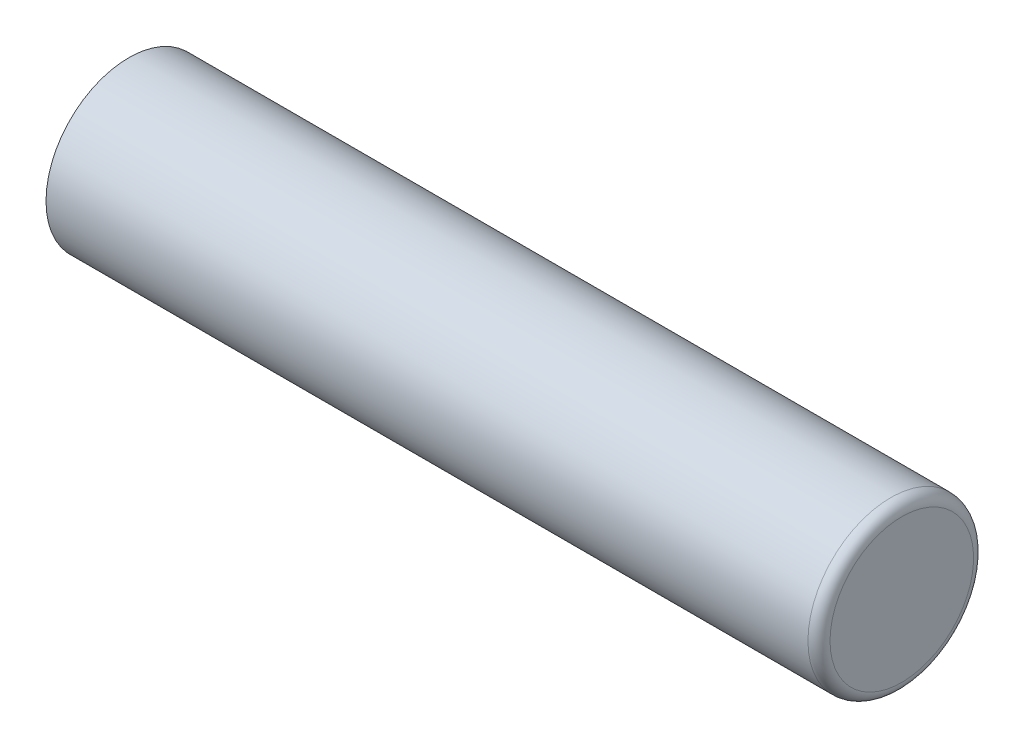
ISO-10303-21;
HEADER;
FILE_DESCRIPTION(('STEP AP214'),'2;1');
FILE_NAME('part.step','',(''),(''),'','','');
FILE_SCHEMA(('AUTOMOTIVE_DESIGN { 1 0 10303 214 1 1 1 1 }'));
ENDSEC;
DATA;
#1=APPLICATION_CONTEXT('core data for automotive mechanical design processes');
#2=APPLICATION_PROTOCOL_DEFINITION('international standard','automotive_design',2000,#1);
#3=PRODUCT_CONTEXT('',#1,'mechanical');
#4=PRODUCT('Part','Part','',(#3));
#5=PRODUCT_RELATED_PRODUCT_CATEGORY('part','',(#4));
#6=PRODUCT_DEFINITION_FORMATION('','',#4);
#7=PRODUCT_DEFINITION_CONTEXT('part definition',#1,'design');
#8=PRODUCT_DEFINITION('design','',#6,#7);
#9=PRODUCT_DEFINITION_SHAPE('','',#8);
#10=(LENGTH_UNIT() NAMED_UNIT(*) SI_UNIT(.MILLI.,.METRE.));
#11=(NAMED_UNIT(*) PLANE_ANGLE_UNIT() SI_UNIT($,.RADIAN.));
#12=(NAMED_UNIT(*) SI_UNIT($,.STERADIAN.) SOLID_ANGLE_UNIT());
#13=UNCERTAINTY_MEASURE_WITH_UNIT(LENGTH_MEASURE(1.E-05),#10,'distance_accuracy_value','');
#14=(GEOMETRIC_REPRESENTATION_CONTEXT(3) GLOBAL_UNCERTAINTY_ASSIGNED_CONTEXT((#13)) GLOBAL_UNIT_ASSIGNED_CONTEXT((#10,
#11,#12)) REPRESENTATION_CONTEXT('',''));
#15=CARTESIAN_POINT('',(0.,0.,0.));
#16=DIRECTION('',(0.,0.,1.));
#17=DIRECTION('',(1.,0.,0.));
#18=AXIS2_PLACEMENT_3D('',#15,#16,#17);
#19=CARTESIAN_POINT('',(-0.340000000000002,1.49999999999998,0.));
#20=DIRECTION('',(1.,0.,0.));
#21=DIRECTION('',(0.,0.,-1.));
#22=AXIS2_PLACEMENT_3D('',#19,#20,#21);
#23=PLANE('',#22);
#24=CARTESIAN_POINT('',(-0.340000000000002,0.,0.));
#25=DIRECTION('',(-1.,0.,0.));
#26=DIRECTION('',(0.,0.,1.));
#27=AXIS2_PLACEMENT_3D('',#24,#25,#26);
#28=CIRCLE('',#27,1.25);
#29=CARTESIAN_POINT('',(-0.340000000000002,0.,1.25));
#30=VERTEX_POINT('',#29);
#31=EDGE_CURVE('E62',#30,#30,#28,.T.);
#32=ORIENTED_EDGE('',*,*,#31,.F.);
#33=EDGE_LOOP('',(#32));
#34=FACE_BOUND('',#33,.T.);
#35=CARTESIAN_POINT('',(-0.340000000000002,0.,0.));
#36=DIRECTION('',(-1.,0.,0.));
#37=DIRECTION('',(0.,0.,1.));
#38=AXIS2_PLACEMENT_3D('',#35,#36,#37);
#39=CIRCLE('',#38,1.49999999999998);
#40=CARTESIAN_POINT('',(-0.340000000000002,0.,1.49999999999998));
#41=VERTEX_POINT('',#40);
#42=EDGE_CURVE('E54',#41,#41,#39,.T.);
#43=ORIENTED_EDGE('',*,*,#42,.T.);
#44=EDGE_LOOP('',(#43));
#45=FACE_BOUND('',#44,.T.);
#46=ADVANCED_FACE('F41',(#34,#45),#23,.F.);
#47=CARTESIAN_POINT('',(13.66,1.49999999999998,0.));
#48=DIRECTION('',(-1.,0.,0.));
#49=DIRECTION('',(0.,0.,1.));
#50=AXIS2_PLACEMENT_3D('',#47,#48,#49);
#51=PLANE('',#50);
#52=CARTESIAN_POINT('',(13.66,0.,0.));
#53=DIRECTION('',(-1.,0.,0.));
#54=DIRECTION('',(0.,0.,1.));
#55=AXIS2_PLACEMENT_3D('',#52,#53,#54);
#56=CIRCLE('',#55,1.29999999999998);
#57=CARTESIAN_POINT('',(13.66,0.,1.29999999999998));
#58=VERTEX_POINT('',#57);
#59=EDGE_CURVE('E10',#58,#58,#56,.F.);
#60=ORIENTED_EDGE('',*,*,#59,.T.);
#61=EDGE_LOOP('',(#60));
#62=FACE_BOUND('',#61,.T.);
#63=ADVANCED_FACE('F80',(#62),#51,.F.);
#64=CARTESIAN_POINT('',(-5.76894587386338,0.,0.));
#65=DIRECTION('',(-1.,0.,0.));
#66=DIRECTION('',(0.,0.,1.));
#67=AXIS2_PLACEMENT_3D('',#64,#65,#66);
#68=CYLINDRICAL_SURFACE('',#67,1.49999999999998);
#69=CARTESIAN_POINT('',(13.46,0.,0.));
#70=DIRECTION('',(-1.,0.,0.));
#71=DIRECTION('',(0.,0.,1.));
#72=AXIS2_PLACEMENT_3D('',#69,#70,#71);
#73=CIRCLE('',#72,1.49999999999998);
#74=CARTESIAN_POINT('',(13.46,0.,1.49999999999998));
#75=VERTEX_POINT('',#74);
#76=EDGE_CURVE('E49',#75,#75,#73,.T.);
#77=ORIENTED_EDGE('',*,*,#76,.T.);
#78=EDGE_LOOP('',(#77));
#79=FACE_BOUND('',#78,.T.);
#80=ORIENTED_EDGE('',*,*,#42,.F.);
#81=EDGE_LOOP('',(#80));
#82=FACE_BOUND('',#81,.T.);
#83=ADVANCED_FACE('F83',(#79,#82),#68,.T.);
#84=CARTESIAN_POINT('',(13.46,0.,0.));
#85=DIRECTION('',(-1.,0.,0.));
#86=DIRECTION('',(0.,0.,1.));
#87=AXIS2_PLACEMENT_3D('',#84,#85,#86);
#88=TOROIDAL_SURFACE('',#87,1.29999999999998,0.2);
#89=ORIENTED_EDGE('',*,*,#59,.F.);
#90=EDGE_LOOP('',(#89));
#91=FACE_BOUND('',#90,.T.);
#92=ORIENTED_EDGE('',*,*,#76,.F.);
#93=EDGE_LOOP('',(#92));
#94=FACE_BOUND('',#93,.T.);
#95=ADVANCED_FACE('F43',(#91,#94),#88,.T.);
#96=CARTESIAN_POINT('',(0.159999999999998,0.,0.));
#97=DIRECTION('',(-1.,0.,0.));
#98=DIRECTION('',(0.,0.,1.));
#99=AXIS2_PLACEMENT_3D('',#96,#97,#98);
#100=CYLINDRICAL_SURFACE('',#99,1.25);
#101=CARTESIAN_POINT('',(0.159999999999998,0.,0.));
#102=DIRECTION('',(-1.,0.,0.));
#103=DIRECTION('',(0.,0.,1.));
#104=AXIS2_PLACEMENT_3D('',#101,#102,#103);
#105=CIRCLE('',#104,1.25);
#106=CARTESIAN_POINT('',(0.159999999999998,0.,1.25));
#107=VERTEX_POINT('',#106);
#108=EDGE_CURVE('E59',#107,#107,#105,.T.);
#109=ORIENTED_EDGE('',*,*,#108,.F.);
#110=EDGE_LOOP('',(#109));
#111=FACE_BOUND('',#110,.T.);
#112=ORIENTED_EDGE('',*,*,#31,.T.);
#113=EDGE_LOOP('',(#112));
#114=FACE_BOUND('',#113,.T.);
#115=ADVANCED_FACE('F72',(#111,#114),#100,.F.);
#116=CARTESIAN_POINT('',(0.159999999999998,0.,0.));
#117=DIRECTION('',(-1.,0.,0.));
#118=DIRECTION('',(0.,0.,1.));
#119=AXIS2_PLACEMENT_3D('',#116,#117,#118);
#120=PLANE('',#119);
#121=ORIENTED_EDGE('',*,*,#108,.T.);
#122=EDGE_LOOP('',(#121));
#123=FACE_BOUND('',#122,.T.);
#124=ADVANCED_FACE('F70',(#123),#120,.T.);
#125=CLOSED_SHELL('',(#46,#63,#83,#95,#115,#124));
#126=MANIFOLD_SOLID_BREP('B2',#125);
#127=ADVANCED_BREP_SHAPE_REPRESENTATION('',(#18,#126),#14);
#128=SHAPE_DEFINITION_REPRESENTATION(#9,#127);
ENDSEC;
END-ISO-10303-21;
